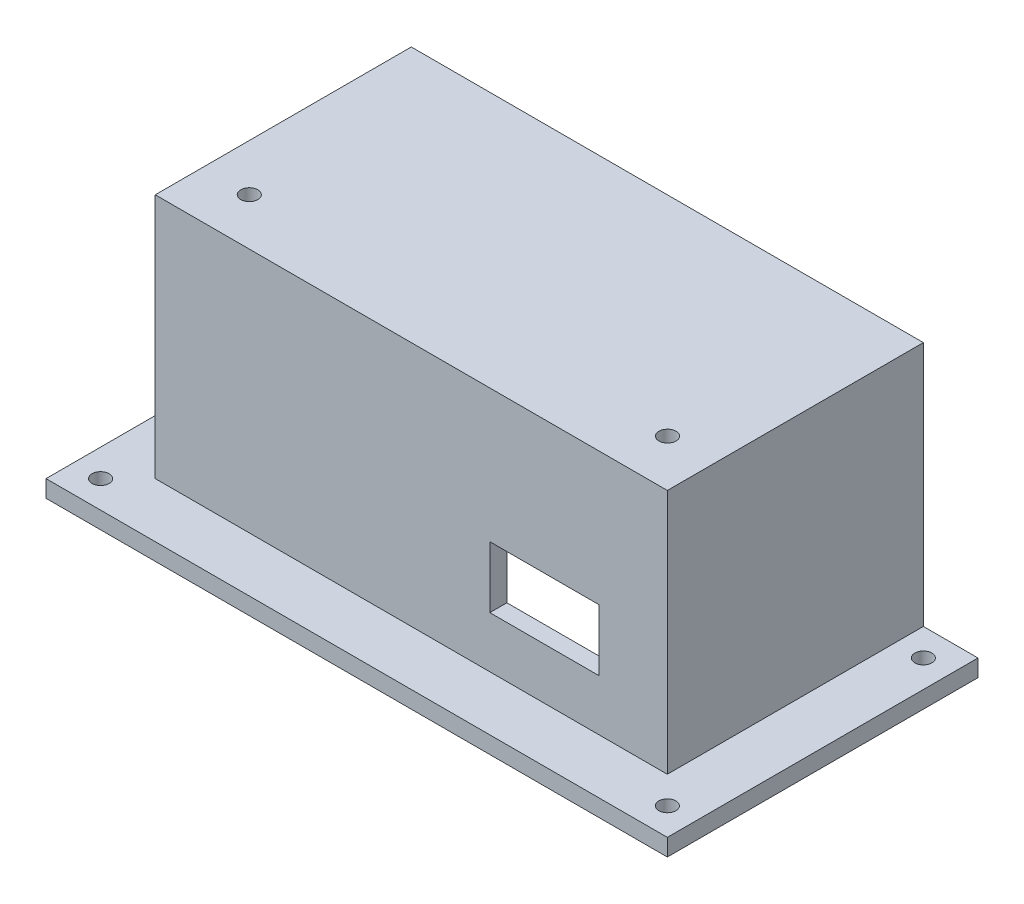
ISO-10303-21;
HEADER;
FILE_DESCRIPTION(('STEP AP214'),'2;1');
FILE_NAME('part.step','',(''),(''),'','','');
FILE_SCHEMA(('AUTOMOTIVE_DESIGN { 1 0 10303 214 1 1 1 1 }'));
ENDSEC;
DATA;
#1=APPLICATION_CONTEXT('core data for automotive mechanical design processes');
#2=APPLICATION_PROTOCOL_DEFINITION('international standard','automotive_design',2000,#1);
#3=PRODUCT_CONTEXT('',#1,'mechanical');
#4=PRODUCT('Part','Part','',(#3));
#5=PRODUCT_RELATED_PRODUCT_CATEGORY('part','',(#4));
#6=PRODUCT_DEFINITION_FORMATION('','',#4);
#7=PRODUCT_DEFINITION_CONTEXT('part definition',#1,'design');
#8=PRODUCT_DEFINITION('design','',#6,#7);
#9=PRODUCT_DEFINITION_SHAPE('','',#8);
#10=(LENGTH_UNIT() NAMED_UNIT(*) SI_UNIT(.MILLI.,.METRE.));
#11=(NAMED_UNIT(*) PLANE_ANGLE_UNIT() SI_UNIT($,.RADIAN.));
#12=(NAMED_UNIT(*) SI_UNIT($,.STERADIAN.) SOLID_ANGLE_UNIT());
#13=UNCERTAINTY_MEASURE_WITH_UNIT(LENGTH_MEASURE(1.E-05),#10,'distance_accuracy_value','');
#14=(GEOMETRIC_REPRESENTATION_CONTEXT(3) GLOBAL_UNCERTAINTY_ASSIGNED_CONTEXT((#13)) GLOBAL_UNIT_ASSIGNED_CONTEXT((#10,
#11,#12)) REPRESENTATION_CONTEXT('',''));
#15=CARTESIAN_POINT('',(0.,0.,0.));
#16=DIRECTION('',(0.,0.,1.));
#17=DIRECTION('',(1.,0.,0.));
#18=AXIS2_PLACEMENT_3D('',#15,#16,#17);
#19=CARTESIAN_POINT('',(0.,0.,0.));
#20=DIRECTION('',(0.,-1.,0.));
#21=DIRECTION('',(0.,0.,-1.));
#22=AXIS2_PLACEMENT_3D('',#19,#20,#21);
#23=PLANE('',#22);
#24=CARTESIAN_POINT('',(83.34375,0.,-5.58799999999999));
#25=DIRECTION('',(0.,-1.,0.));
#26=DIRECTION('',(0.,0.,-1.));
#27=AXIS2_PLACEMENT_3D('',#24,#25,#26);
#28=CIRCLE('',#27,1.5875);
#29=CARTESIAN_POINT('',(83.34375,0.,-7.17549999999999));
#30=VERTEX_POINT('',#29);
#31=EDGE_CURVE('E240',#30,#30,#28,.T.);
#32=ORIENTED_EDGE('',*,*,#31,.F.);
#33=EDGE_LOOP('',(#32));
#34=FACE_BOUND('',#33,.T.);
#35=CARTESIAN_POINT('',(5.55625,0.,-5.588));
#36=DIRECTION('',(0.,-1.,0.));
#37=DIRECTION('',(0.,0.,-1.));
#38=AXIS2_PLACEMENT_3D('',#35,#36,#37);
#39=CIRCLE('',#38,1.5875);
#40=CARTESIAN_POINT('',(5.55625,0.,-7.1755));
#41=VERTEX_POINT('',#40);
#42=EDGE_CURVE('E241',#41,#41,#39,.T.);
#43=ORIENTED_EDGE('',*,*,#42,.F.);
#44=EDGE_LOOP('',(#43));
#45=FACE_BOUND('',#44,.T.);
#46=DIRECTION('',(0.,0.,1.));
#47=VECTOR('',#46,1.);
#48=CARTESIAN_POINT('',(0.,0.,0.));
#49=LINE('',#48,#47);
#50=CARTESIAN_POINT('',(0.,0.,-41.275));
#51=VERTEX_POINT('',#50);
#52=CARTESIAN_POINT('',(0.,0.,0.));
#53=VERTEX_POINT('',#52);
#54=EDGE_CURVE('E186',#51,#53,#49,.T.);
#55=ORIENTED_EDGE('',*,*,#54,.F.);
#56=DIRECTION('',(-1.,0.,0.));
#57=VECTOR('',#56,1.);
#58=CARTESIAN_POINT('',(0.,0.,-41.275));
#59=LINE('',#58,#57);
#60=CARTESIAN_POINT('',(88.9,0.,-41.275));
#61=VERTEX_POINT('',#60);
#62=EDGE_CURVE('E173',#61,#51,#59,.T.);
#63=ORIENTED_EDGE('',*,*,#62,.F.);
#64=DIRECTION('',(0.,0.,-1.));
#65=VECTOR('',#64,1.);
#66=CARTESIAN_POINT('',(88.9,0.,0.));
#67=LINE('',#66,#65);
#68=CARTESIAN_POINT('',(88.9,0.,0.));
#69=VERTEX_POINT('',#68);
#70=EDGE_CURVE('E39',#69,#61,#67,.T.);
#71=ORIENTED_EDGE('',*,*,#70,.F.);
#72=DIRECTION('',(1.,0.,0.));
#73=VECTOR('',#72,1.);
#74=CARTESIAN_POINT('',(0.,0.,0.));
#75=LINE('',#74,#73);
#76=EDGE_CURVE('E192',#53,#69,#75,.T.);
#77=ORIENTED_EDGE('',*,*,#76,.F.);
#78=EDGE_LOOP('',(#55,#63,#71,#77));
#79=FACE_BOUND('',#78,.T.);
#80=ADVANCED_FACE('F35',(#34,#45,#79),#23,.T.);
#81=CARTESIAN_POINT('',(0.,3.175,0.));
#82=DIRECTION('',(-1.,0.,0.));
#83=DIRECTION('',(0.,0.,1.));
#84=AXIS2_PLACEMENT_3D('',#81,#82,#83);
#85=PLANE('',#84);
#86=DIRECTION('',(0.,0.,-1.));
#87=VECTOR('',#86,1.);
#88=CARTESIAN_POINT('',(0.,-15.24,-41.275));
#89=LINE('',#88,#87);
#90=CARTESIAN_POINT('',(0.,-15.24,-41.275));
#91=VERTEX_POINT('',#90);
#92=CARTESIAN_POINT('',(0.,-15.24,-44.45));
#93=VERTEX_POINT('',#92);
#94=EDGE_CURVE('E51',#91,#93,#89,.T.);
#95=ORIENTED_EDGE('',*,*,#94,.F.);
#96=DIRECTION('',(0.,-1.,0.));
#97=VECTOR('',#96,1.);
#98=CARTESIAN_POINT('',(0.,0.,-41.275));
#99=LINE('',#98,#97);
#100=EDGE_CURVE('E176',#51,#91,#99,.T.);
#101=ORIENTED_EDGE('',*,*,#100,.F.);
#102=ORIENTED_EDGE('',*,*,#54,.T.);
#103=DIRECTION('',(0.,-1.,0.));
#104=VECTOR('',#103,1.);
#105=CARTESIAN_POINT('',(0.,3.175,0.));
#106=LINE('',#105,#104);
#107=CARTESIAN_POINT('',(0.,-45.72,0.));
#108=VERTEX_POINT('',#107);
#109=EDGE_CURVE('E213',#53,#108,#106,.T.);
#110=ORIENTED_EDGE('',*,*,#109,.T.);
#111=DIRECTION('',(0.,0.,-1.));
#112=VECTOR('',#111,1.);
#113=CARTESIAN_POINT('',(0.,-45.72,0.));
#114=LINE('',#113,#112);
#115=CARTESIAN_POINT('',(0.,-45.72,-44.45));
#116=VERTEX_POINT('',#115);
#117=EDGE_CURVE('E228',#108,#116,#114,.T.);
#118=ORIENTED_EDGE('',*,*,#117,.T.);
#119=DIRECTION('',(0.,-1.,0.));
#120=VECTOR('',#119,1.);
#121=CARTESIAN_POINT('',(0.,3.175,-44.45));
#122=LINE('',#121,#120);
#123=EDGE_CURVE('E211',#93,#116,#122,.T.);
#124=ORIENTED_EDGE('',*,*,#123,.F.);
#125=EDGE_LOOP('',(#95,#101,#102,#110,#118,#124));
#126=FACE_BOUND('',#125,.T.);
#127=ADVANCED_FACE('F185',(#126),#85,.F.);
#128=CARTESIAN_POINT('',(-3.17499999999999,3.175,0.));
#129=DIRECTION('',(1.,0.,0.));
#130=DIRECTION('',(0.,0.,-1.));
#131=AXIS2_PLACEMENT_3D('',#128,#129,#130);
#132=PLANE('',#131);
#133=DIRECTION('',(0.,0.,-1.));
#134=VECTOR('',#133,1.);
#135=CARTESIAN_POINT('',(-3.17499999999999,-42.545,0.));
#136=LINE('',#135,#134);
#137=CARTESIAN_POINT('',(-3.17499999999999,-42.545,3.175));
#138=VERTEX_POINT('',#137);
#139=CARTESIAN_POINT('',(-3.17499999999999,-42.545,-44.45));
#140=VERTEX_POINT('',#139);
#141=EDGE_CURVE('E260',#138,#140,#136,.T.);
#142=ORIENTED_EDGE('',*,*,#141,.F.);
#143=DIRECTION('',(0.,-1.,0.));
#144=VECTOR('',#143,1.);
#145=CARTESIAN_POINT('',(-3.17499999999999,3.175,3.175));
#146=LINE('',#145,#144);
#147=CARTESIAN_POINT('',(-3.17499999999999,3.175,3.175));
#148=VERTEX_POINT('',#147);
#149=EDGE_CURVE('E206',#148,#138,#146,.T.);
#150=ORIENTED_EDGE('',*,*,#149,.F.);
#151=DIRECTION('',(0.,0.,1.));
#152=VECTOR('',#151,1.);
#153=CARTESIAN_POINT('',(-3.17499999999999,3.175,0.));
#154=LINE('',#153,#152);
#155=CARTESIAN_POINT('',(-3.17499999999999,3.175,-44.45));
#156=VERTEX_POINT('',#155);
#157=EDGE_CURVE('E203',#156,#148,#154,.T.);
#158=ORIENTED_EDGE('',*,*,#157,.F.);
#159=DIRECTION('',(0.,-1.,0.));
#160=VECTOR('',#159,1.);
#161=CARTESIAN_POINT('',(-3.17499999999999,3.175,-44.45));
#162=LINE('',#161,#160);
#163=EDGE_CURVE('E209',#156,#140,#162,.T.);
#164=ORIENTED_EDGE('',*,*,#163,.T.);
#165=EDGE_LOOP('',(#142,#150,#158,#164));
#166=FACE_BOUND('',#165,.T.);
#167=ADVANCED_FACE('F396',(#166),#132,.F.);
#168=CARTESIAN_POINT('',(0.,3.175,3.175));
#169=DIRECTION('',(0.,0.,-1.));
#170=DIRECTION('',(-1.,0.,0.));
#171=AXIS2_PLACEMENT_3D('',#168,#169,#170);
#172=PLANE('',#171);
#173=DIRECTION('',(1.,0.,0.));
#174=VECTOR('',#173,1.);
#175=CARTESIAN_POINT('',(59.055,-33.02,3.175));
#176=LINE('',#175,#174);
#177=CARTESIAN_POINT('',(59.055,-33.02,3.175));
#178=VERTEX_POINT('',#177);
#179=CARTESIAN_POINT('',(79.375,-33.02,3.175));
#180=VERTEX_POINT('',#179);
#181=EDGE_CURVE('E326',#178,#180,#176,.T.);
#182=ORIENTED_EDGE('',*,*,#181,.F.);
#183=DIRECTION('',(0.,-1.,0.));
#184=VECTOR('',#183,1.);
#185=CARTESIAN_POINT('',(59.055,-21.59,3.175));
#186=LINE('',#185,#184);
#187=CARTESIAN_POINT('',(59.055,-21.59,3.175));
#188=VERTEX_POINT('',#187);
#189=EDGE_CURVE('E59',#188,#178,#186,.T.);
#190=ORIENTED_EDGE('',*,*,#189,.F.);
#191=DIRECTION('',(-1.,0.,0.));
#192=VECTOR('',#191,1.);
#193=CARTESIAN_POINT('',(59.055,-21.59,3.175));
#194=LINE('',#193,#192);
#195=CARTESIAN_POINT('',(79.375,-21.59,3.175));
#196=VERTEX_POINT('',#195);
#197=EDGE_CURVE('E319',#196,#188,#194,.T.);
#198=ORIENTED_EDGE('',*,*,#197,.F.);
#199=DIRECTION('',(0.,1.,0.));
#200=VECTOR('',#199,1.);
#201=CARTESIAN_POINT('',(79.375,-21.59,3.175));
#202=LINE('',#201,#200);
#203=EDGE_CURVE('E323',#180,#196,#202,.T.);
#204=ORIENTED_EDGE('',*,*,#203,.F.);
#205=EDGE_LOOP('',(#182,#190,#198,#204));
#206=FACE_BOUND('',#205,.T.);
#207=DIRECTION('',(-1.,0.,0.));
#208=VECTOR('',#207,1.);
#209=CARTESIAN_POINT('',(0.,-42.545,3.175));
#210=LINE('',#209,#208);
#211=CARTESIAN_POINT('',(92.075,-42.545,3.175));
#212=VERTEX_POINT('',#211);
#213=EDGE_CURVE('E282',#212,#138,#210,.T.);
#214=ORIENTED_EDGE('',*,*,#213,.F.);
#215=DIRECTION('',(0.,-1.,0.));
#216=VECTOR('',#215,1.);
#217=CARTESIAN_POINT('',(92.075,3.175,3.175));
#218=LINE('',#217,#216);
#219=CARTESIAN_POINT('',(92.075,3.175,3.175));
#220=VERTEX_POINT('',#219);
#221=EDGE_CURVE('E202',#220,#212,#218,.T.);
#222=ORIENTED_EDGE('',*,*,#221,.F.);
#223=DIRECTION('',(1.,0.,0.));
#224=VECTOR('',#223,1.);
#225=CARTESIAN_POINT('',(0.,3.175,3.175));
#226=LINE('',#225,#224);
#227=EDGE_CURVE('E217',#148,#220,#226,.T.);
#228=ORIENTED_EDGE('',*,*,#227,.F.);
#229=ORIENTED_EDGE('',*,*,#149,.T.);
#230=EDGE_LOOP('',(#214,#222,#228,#229));
#231=FACE_BOUND('',#230,.T.);
#232=ADVANCED_FACE('F436',(#206,#231),#172,.F.);
#233=CARTESIAN_POINT('',(92.075,3.175,0.));
#234=DIRECTION('',(1.,0.,0.));
#235=DIRECTION('',(0.,0.,-1.));
#236=AXIS2_PLACEMENT_3D('',#233,#234,#235);
#237=PLANE('',#236);
#238=ORIENTED_EDGE('',*,*,#221,.T.);
#239=DIRECTION('',(0.,0.,-1.));
#240=VECTOR('',#239,1.);
#241=CARTESIAN_POINT('',(92.075,-42.545,0.));
#242=LINE('',#241,#240);
#243=CARTESIAN_POINT('',(92.075,-42.545,-44.45));
#244=VERTEX_POINT('',#243);
#245=EDGE_CURVE('E280',#212,#244,#242,.T.);
#246=ORIENTED_EDGE('',*,*,#245,.T.);
#247=DIRECTION('',(0.,-1.,0.));
#248=VECTOR('',#247,1.);
#249=CARTESIAN_POINT('',(92.075,3.175,-44.45));
#250=LINE('',#249,#248);
#251=CARTESIAN_POINT('',(92.075,3.175,-44.45));
#252=VERTEX_POINT('',#251);
#253=EDGE_CURVE('E199',#252,#244,#250,.T.);
#254=ORIENTED_EDGE('',*,*,#253,.F.);
#255=DIRECTION('',(0.,0.,1.));
#256=VECTOR('',#255,1.);
#257=CARTESIAN_POINT('',(92.075,3.175,0.));
#258=LINE('',#257,#256);
#259=EDGE_CURVE('E219',#252,#220,#258,.T.);
#260=ORIENTED_EDGE('',*,*,#259,.T.);
#261=EDGE_LOOP('',(#238,#246,#254,#260));
#262=FACE_BOUND('',#261,.T.);
#263=ADVANCED_FACE('F403',(#262),#237,.T.);
#264=CARTESIAN_POINT('',(0.,3.175,-44.45));
#265=DIRECTION('',(0.,0.,1.));
#266=DIRECTION('',(1.,0.,0.));
#267=AXIS2_PLACEMENT_3D('',#264,#265,#266);
#268=PLANE('',#267);
#269=DIRECTION('',(0.,-1.,0.));
#270=VECTOR('',#269,1.);
#271=CARTESIAN_POINT('',(88.9,3.175,-44.45));
#272=LINE('',#271,#270);
#273=CARTESIAN_POINT('',(88.9,-2.54,-44.45));
#274=VERTEX_POINT('',#273);
#275=CARTESIAN_POINT('',(88.9,-45.72,-44.45));
#276=VERTEX_POINT('',#275);
#277=EDGE_CURVE('E194',#274,#276,#272,.T.);
#278=ORIENTED_EDGE('',*,*,#277,.F.);
#279=DIRECTION('',(-1.,0.,0.));
#280=VECTOR('',#279,1.);
#281=CARTESIAN_POINT('',(0.,-2.54,-44.45));
#282=LINE('',#281,#280);
#283=CARTESIAN_POINT('',(44.45,-2.54,-44.45));
#284=VERTEX_POINT('',#283);
#285=EDGE_CURVE('E353',#274,#284,#282,.T.);
#286=ORIENTED_EDGE('',*,*,#285,.T.);
#287=DIRECTION('',(0.,-1.,0.));
#288=VECTOR('',#287,1.);
#289=CARTESIAN_POINT('',(44.45,0.,-44.45));
#290=LINE('',#289,#288);
#291=CARTESIAN_POINT('',(44.45,-15.24,-44.45));
#292=VERTEX_POINT('',#291);
#293=EDGE_CURVE('E350',#284,#292,#290,.T.);
#294=ORIENTED_EDGE('',*,*,#293,.T.);
#295=DIRECTION('',(1.,0.,0.));
#296=VECTOR('',#295,1.);
#297=CARTESIAN_POINT('',(0.,-15.24,-44.45));
#298=LINE('',#297,#296);
#299=EDGE_CURVE('E189',#93,#292,#298,.T.);
#300=ORIENTED_EDGE('',*,*,#299,.F.);
#301=ORIENTED_EDGE('',*,*,#123,.T.);
#302=DIRECTION('',(1.,0.,0.));
#303=VECTOR('',#302,1.);
#304=CARTESIAN_POINT('',(0.,-45.72,-44.45));
#305=LINE('',#304,#303);
#306=CARTESIAN_POINT('',(-13.335,-45.72,-44.45));
#307=VERTEX_POINT('',#306);
#308=EDGE_CURVE('E231',#307,#116,#305,.T.);
#309=ORIENTED_EDGE('',*,*,#308,.F.);
#310=DIRECTION('',(0.,-1.,0.));
#311=VECTOR('',#310,1.);
#312=CARTESIAN_POINT('',(-13.335,-42.545,-44.45));
#313=LINE('',#312,#311);
#314=CARTESIAN_POINT('',(-13.335,-42.545,-44.45));
#315=VERTEX_POINT('',#314);
#316=EDGE_CURVE('E244',#315,#307,#313,.T.);
#317=ORIENTED_EDGE('',*,*,#316,.F.);
#318=DIRECTION('',(-1.,0.,0.));
#319=VECTOR('',#318,1.);
#320=CARTESIAN_POINT('',(0.,-42.545,-44.45));
#321=LINE('',#320,#319);
#322=EDGE_CURVE('E251',#140,#315,#321,.T.);
#323=ORIENTED_EDGE('',*,*,#322,.F.);
#324=ORIENTED_EDGE('',*,*,#163,.F.);
#325=DIRECTION('',(-1.,0.,0.));
#326=VECTOR('',#325,1.);
#327=CARTESIAN_POINT('',(0.,3.175,-44.45));
#328=LINE('',#327,#326);
#329=EDGE_CURVE('E11',#252,#156,#328,.T.);
#330=ORIENTED_EDGE('',*,*,#329,.F.);
#331=ORIENTED_EDGE('',*,*,#253,.T.);
#332=DIRECTION('',(1.,0.,0.));
#333=VECTOR('',#332,1.);
#334=CARTESIAN_POINT('',(0.,-42.545,-44.4500000000001));
#335=LINE('',#334,#333);
#336=CARTESIAN_POINT('',(102.235,-42.545,-44.45));
#337=VERTEX_POINT('',#336);
#338=EDGE_CURVE('E277',#244,#337,#335,.T.);
#339=ORIENTED_EDGE('',*,*,#338,.T.);
#340=DIRECTION('',(0.,-1.,0.));
#341=VECTOR('',#340,1.);
#342=CARTESIAN_POINT('',(102.235,-42.545,-44.45));
#343=LINE('',#342,#341);
#344=CARTESIAN_POINT('',(102.235,-45.72,-44.45));
#345=VERTEX_POINT('',#344);
#346=EDGE_CURVE('E247',#337,#345,#343,.T.);
#347=ORIENTED_EDGE('',*,*,#346,.T.);
#348=EDGE_CURVE('E232',#276,#345,#305,.T.);
#349=ORIENTED_EDGE('',*,*,#348,.F.);
#350=EDGE_LOOP('',(#278,#286,#294,#300,#301,#309,#317,#323,#324,#330,#331,#339,#347,#349));
#351=FACE_BOUND('',#350,.T.);
#352=ADVANCED_FACE('F37',(#351),#268,.F.);
#353=CARTESIAN_POINT('',(0.,3.175,0.));
#354=DIRECTION('',(0.,-1.,0.));
#355=DIRECTION('',(0.,0.,-1.));
#356=AXIS2_PLACEMENT_3D('',#353,#354,#355);
#357=PLANE('',#356);
#358=CARTESIAN_POINT('',(83.34375,3.175,-5.58799999999999));
#359=DIRECTION('',(0.,-1.,0.));
#360=DIRECTION('',(0.,0.,-1.));
#361=AXIS2_PLACEMENT_3D('',#358,#359,#360);
#362=CIRCLE('',#361,1.5875);
#363=CARTESIAN_POINT('',(83.34375,3.175,-7.17549999999999));
#364=VERTEX_POINT('',#363);
#365=EDGE_CURVE('E234',#364,#364,#362,.T.);
#366=ORIENTED_EDGE('',*,*,#365,.T.);
#367=EDGE_LOOP('',(#366));
#368=FACE_BOUND('',#367,.T.);
#369=CARTESIAN_POINT('',(5.55625,3.175,-5.588));
#370=DIRECTION('',(0.,-1.,0.));
#371=DIRECTION('',(0.,0.,-1.));
#372=AXIS2_PLACEMENT_3D('',#369,#370,#371);
#373=CIRCLE('',#372,1.5875);
#374=CARTESIAN_POINT('',(5.55625,3.175,-7.1755));
#375=VERTEX_POINT('',#374);
#376=EDGE_CURVE('E237',#375,#375,#373,.T.);
#377=ORIENTED_EDGE('',*,*,#376,.T.);
#378=EDGE_LOOP('',(#377));
#379=FACE_BOUND('',#378,.T.);
#380=ORIENTED_EDGE('',*,*,#259,.F.);
#381=ORIENTED_EDGE('',*,*,#329,.T.);
#382=ORIENTED_EDGE('',*,*,#157,.T.);
#383=ORIENTED_EDGE('',*,*,#227,.T.);
#384=EDGE_LOOP('',(#380,#381,#382,#383));
#385=FACE_BOUND('',#384,.T.);
#386=ADVANCED_FACE('F400',(#368,#379,#385),#357,.F.);
#387=CARTESIAN_POINT('',(88.9,3.175,0.));
#388=DIRECTION('',(1.,0.,0.));
#389=DIRECTION('',(0.,0.,-1.));
#390=AXIS2_PLACEMENT_3D('',#387,#388,#389);
#391=PLANE('',#390);
#392=DIRECTION('',(0.,1.,0.));
#393=VECTOR('',#392,1.);
#394=CARTESIAN_POINT('',(88.9,0.,-41.275));
#395=LINE('',#394,#393);
#396=CARTESIAN_POINT('',(88.9,-2.54,-41.275));
#397=VERTEX_POINT('',#396);
#398=EDGE_CURVE('E179',#397,#61,#395,.T.);
#399=ORIENTED_EDGE('',*,*,#398,.F.);
#400=DIRECTION('',(0.,0.,-1.));
#401=VECTOR('',#400,1.);
#402=CARTESIAN_POINT('',(88.9,-2.54,-41.275));
#403=LINE('',#402,#401);
#404=EDGE_CURVE('E340',#397,#274,#403,.T.);
#405=ORIENTED_EDGE('',*,*,#404,.T.);
#406=ORIENTED_EDGE('',*,*,#277,.T.);
#407=DIRECTION('',(0.,0.,1.));
#408=VECTOR('',#407,1.);
#409=CARTESIAN_POINT('',(88.9,-45.72,0.));
#410=LINE('',#409,#408);
#411=CARTESIAN_POINT('',(88.9,-45.72,0.));
#412=VERTEX_POINT('',#411);
#413=EDGE_CURVE('E222',#276,#412,#410,.T.);
#414=ORIENTED_EDGE('',*,*,#413,.T.);
#415=DIRECTION('',(0.,-1.,0.));
#416=VECTOR('',#415,1.);
#417=CARTESIAN_POINT('',(88.9,3.175,0.));
#418=LINE('',#417,#416);
#419=EDGE_CURVE('E196',#69,#412,#418,.T.);
#420=ORIENTED_EDGE('',*,*,#419,.F.);
#421=ORIENTED_EDGE('',*,*,#70,.T.);
#422=EDGE_LOOP('',(#399,#405,#406,#414,#420,#421));
#423=FACE_BOUND('',#422,.T.);
#424=ADVANCED_FACE('F368',(#423),#391,.F.);
#425=CARTESIAN_POINT('',(0.,3.175,0.));
#426=DIRECTION('',(0.,0.,1.));
#427=DIRECTION('',(1.,0.,0.));
#428=AXIS2_PLACEMENT_3D('',#425,#426,#427);
#429=PLANE('',#428);
#430=DIRECTION('',(-1.,0.,0.));
#431=VECTOR('',#430,1.);
#432=CARTESIAN_POINT('',(59.055,-21.59,0.));
#433=LINE('',#432,#431);
#434=CARTESIAN_POINT('',(79.375,-21.59,0.));
#435=VERTEX_POINT('',#434);
#436=CARTESIAN_POINT('',(59.055,-21.59,0.));
#437=VERTEX_POINT('',#436);
#438=EDGE_CURVE('E314',#435,#437,#433,.T.);
#439=ORIENTED_EDGE('',*,*,#438,.T.);
#440=DIRECTION('',(0.,-1.,0.));
#441=VECTOR('',#440,1.);
#442=CARTESIAN_POINT('',(59.055,-21.59,0.));
#443=LINE('',#442,#441);
#444=CARTESIAN_POINT('',(59.055,-33.02,0.));
#445=VERTEX_POINT('',#444);
#446=EDGE_CURVE('E322',#437,#445,#443,.T.);
#447=ORIENTED_EDGE('',*,*,#446,.T.);
#448=DIRECTION('',(1.,0.,0.));
#449=VECTOR('',#448,1.);
#450=CARTESIAN_POINT('',(59.055,-33.02,0.));
#451=LINE('',#450,#449);
#452=CARTESIAN_POINT('',(79.375,-33.02,0.));
#453=VERTEX_POINT('',#452);
#454=EDGE_CURVE('E335',#445,#453,#451,.T.);
#455=ORIENTED_EDGE('',*,*,#454,.T.);
#456=DIRECTION('',(0.,1.,0.));
#457=VECTOR('',#456,1.);
#458=CARTESIAN_POINT('',(79.375,-21.59,0.));
#459=LINE('',#458,#457);
#460=EDGE_CURVE('E332',#453,#435,#459,.T.);
#461=ORIENTED_EDGE('',*,*,#460,.T.);
#462=EDGE_LOOP('',(#439,#447,#455,#461));
#463=FACE_BOUND('',#462,.T.);
#464=ORIENTED_EDGE('',*,*,#76,.T.);
#465=ORIENTED_EDGE('',*,*,#419,.T.);
#466=DIRECTION('',(-1.,0.,0.));
#467=VECTOR('',#466,1.);
#468=CARTESIAN_POINT('',(0.,-45.72,0.));
#469=LINE('',#468,#467);
#470=EDGE_CURVE('E225',#412,#108,#469,.T.);
#471=ORIENTED_EDGE('',*,*,#470,.T.);
#472=ORIENTED_EDGE('',*,*,#109,.F.);
#473=EDGE_LOOP('',(#464,#465,#471,#472));
#474=FACE_BOUND('',#473,.T.);
#475=ADVANCED_FACE('F372',(#463,#474),#429,.F.);
#476=CARTESIAN_POINT('',(0.,-45.72,0.));
#477=DIRECTION('',(0.,-1.,0.));
#478=DIRECTION('',(0.,0.,-1.));
#479=AXIS2_PLACEMENT_3D('',#476,#477,#478);
#480=PLANE('',#479);
#481=CARTESIAN_POINT('',(97.155,-45.72,-39.37));
#482=DIRECTION('',(0.,1.,0.));
#483=DIRECTION('',(0.,0.,1.));
#484=AXIS2_PLACEMENT_3D('',#481,#482,#483);
#485=CIRCLE('',#484,1.5875);
#486=CARTESIAN_POINT('',(97.155,-45.72,-37.7825));
#487=VERTEX_POINT('',#486);
#488=EDGE_CURVE('E296',#487,#487,#485,.T.);
#489=ORIENTED_EDGE('',*,*,#488,.T.);
#490=EDGE_LOOP('',(#489));
#491=FACE_BOUND('',#490,.T.);
#492=CARTESIAN_POINT('',(97.155,-45.72,8.25500000000001));
#493=DIRECTION('',(0.,1.,0.));
#494=DIRECTION('',(0.,0.,1.));
#495=AXIS2_PLACEMENT_3D('',#492,#493,#494);
#496=CIRCLE('',#495,1.5875);
#497=CARTESIAN_POINT('',(97.155,-45.72,9.8425));
#498=VERTEX_POINT('',#497);
#499=EDGE_CURVE('E303',#498,#498,#496,.T.);
#500=ORIENTED_EDGE('',*,*,#499,.T.);
#501=EDGE_LOOP('',(#500));
#502=FACE_BOUND('',#501,.T.);
#503=CARTESIAN_POINT('',(-8.255,-45.72,8.255));
#504=DIRECTION('',(0.,1.,0.));
#505=DIRECTION('',(0.,0.,1.));
#506=AXIS2_PLACEMENT_3D('',#503,#504,#505);
#507=CIRCLE('',#506,1.5875);
#508=CARTESIAN_POINT('',(-8.255,-45.72,9.8425));
#509=VERTEX_POINT('',#508);
#510=EDGE_CURVE('E290',#509,#509,#507,.T.);
#511=ORIENTED_EDGE('',*,*,#510,.T.);
#512=EDGE_LOOP('',(#511));
#513=FACE_BOUND('',#512,.T.);
#514=CARTESIAN_POINT('',(-8.255,-45.72,-39.37));
#515=DIRECTION('',(0.,1.,0.));
#516=DIRECTION('',(0.,0.,1.));
#517=AXIS2_PLACEMENT_3D('',#514,#515,#516);
#518=CIRCLE('',#517,1.5875);
#519=CARTESIAN_POINT('',(-8.255,-45.72,-37.7825));
#520=VERTEX_POINT('',#519);
#521=EDGE_CURVE('E267',#520,#520,#518,.T.);
#522=ORIENTED_EDGE('',*,*,#521,.T.);
#523=EDGE_LOOP('',(#522));
#524=FACE_BOUND('',#523,.T.);
#525=ORIENTED_EDGE('',*,*,#348,.T.);
#526=DIRECTION('',(0.,0.,1.));
#527=VECTOR('',#526,1.);
#528=CARTESIAN_POINT('',(102.235,-45.72,0.));
#529=LINE('',#528,#527);
#530=CARTESIAN_POINT('',(102.235,-45.72,13.335));
#531=VERTEX_POINT('',#530);
#532=EDGE_CURVE('E264',#345,#531,#529,.T.);
#533=ORIENTED_EDGE('',*,*,#532,.T.);
#534=DIRECTION('',(-1.,0.,0.));
#535=VECTOR('',#534,1.);
#536=CARTESIAN_POINT('',(0.,-45.72,13.335));
#537=LINE('',#536,#535);
#538=CARTESIAN_POINT('',(-13.335,-45.72,13.335));
#539=VERTEX_POINT('',#538);
#540=EDGE_CURVE('E261',#531,#539,#537,.T.);
#541=ORIENTED_EDGE('',*,*,#540,.T.);
#542=DIRECTION('',(0.,0.,1.));
#543=VECTOR('',#542,1.);
#544=CARTESIAN_POINT('',(-13.335,-45.72,0.));
#545=LINE('',#544,#543);
#546=EDGE_CURVE('E257',#307,#539,#545,.T.);
#547=ORIENTED_EDGE('',*,*,#546,.F.);
#548=ORIENTED_EDGE('',*,*,#308,.T.);
#549=ORIENTED_EDGE('',*,*,#117,.F.);
#550=ORIENTED_EDGE('',*,*,#470,.F.);
#551=ORIENTED_EDGE('',*,*,#413,.F.);
#552=EDGE_LOOP('',(#525,#533,#541,#547,#548,#549,#550,#551));
#553=FACE_BOUND('',#552,.T.);
#554=ADVANCED_FACE('F377',(#491,#502,#513,#524,#553),#480,.T.);
#555=CARTESIAN_POINT('',(5.55625,45.72,-5.588));
#556=DIRECTION('',(0.,-1.,0.));
#557=DIRECTION('',(0.,0.,-1.));
#558=AXIS2_PLACEMENT_3D('',#555,#556,#557);
#559=CYLINDRICAL_SURFACE('',#558,1.5875);
#560=ORIENTED_EDGE('',*,*,#42,.T.);
#561=EDGE_LOOP('',(#560));
#562=FACE_BOUND('',#561,.T.);
#563=ORIENTED_EDGE('',*,*,#376,.F.);
#564=EDGE_LOOP('',(#563));
#565=FACE_BOUND('',#564,.T.);
#566=ADVANCED_FACE('F449',(#562,#565),#559,.F.);
#567=CARTESIAN_POINT('',(83.34375,45.72,-5.58799999999999));
#568=DIRECTION('',(0.,-1.,0.));
#569=DIRECTION('',(0.,0.,-1.));
#570=AXIS2_PLACEMENT_3D('',#567,#568,#569);
#571=CYLINDRICAL_SURFACE('',#570,1.5875);
#572=ORIENTED_EDGE('',*,*,#31,.T.);
#573=EDGE_LOOP('',(#572));
#574=FACE_BOUND('',#573,.T.);
#575=ORIENTED_EDGE('',*,*,#365,.F.);
#576=EDGE_LOOP('',(#575));
#577=FACE_BOUND('',#576,.T.);
#578=ADVANCED_FACE('F420',(#574,#577),#571,.F.);
#579=CARTESIAN_POINT('',(-13.335,-42.545,0.));
#580=DIRECTION('',(1.,0.,0.));
#581=DIRECTION('',(0.,0.,-1.));
#582=AXIS2_PLACEMENT_3D('',#579,#580,#581);
#583=PLANE('',#582);
#584=ORIENTED_EDGE('',*,*,#546,.T.);
#585=DIRECTION('',(0.,-1.,0.));
#586=VECTOR('',#585,1.);
#587=CARTESIAN_POINT('',(-13.335,-42.545,13.335));
#588=LINE('',#587,#586);
#589=CARTESIAN_POINT('',(-13.335,-42.545,13.335));
#590=VERTEX_POINT('',#589);
#591=EDGE_CURVE('E253',#590,#539,#588,.T.);
#592=ORIENTED_EDGE('',*,*,#591,.F.);
#593=DIRECTION('',(0.,0.,1.));
#594=VECTOR('',#593,1.);
#595=CARTESIAN_POINT('',(-13.335,-42.545,0.));
#596=LINE('',#595,#594);
#597=EDGE_CURVE('E269',#315,#590,#596,.T.);
#598=ORIENTED_EDGE('',*,*,#597,.F.);
#599=ORIENTED_EDGE('',*,*,#316,.T.);
#600=EDGE_LOOP('',(#584,#592,#598,#599));
#601=FACE_BOUND('',#600,.T.);
#602=ADVANCED_FACE('F385',(#601),#583,.F.);
#603=CARTESIAN_POINT('',(0.,-42.545,13.335));
#604=DIRECTION('',(0.,0.,1.));
#605=DIRECTION('',(1.,0.,0.));
#606=AXIS2_PLACEMENT_3D('',#603,#604,#605);
#607=PLANE('',#606);
#608=ORIENTED_EDGE('',*,*,#540,.F.);
#609=DIRECTION('',(0.,-1.,0.));
#610=VECTOR('',#609,1.);
#611=CARTESIAN_POINT('',(102.235,-42.545,13.335));
#612=LINE('',#611,#610);
#613=CARTESIAN_POINT('',(102.235,-42.545,13.335));
#614=VERTEX_POINT('',#613);
#615=EDGE_CURVE('E250',#614,#531,#612,.T.);
#616=ORIENTED_EDGE('',*,*,#615,.F.);
#617=DIRECTION('',(-1.,0.,0.));
#618=VECTOR('',#617,1.);
#619=CARTESIAN_POINT('',(0.,-42.545,13.335));
#620=LINE('',#619,#618);
#621=EDGE_CURVE('E271',#614,#590,#620,.T.);
#622=ORIENTED_EDGE('',*,*,#621,.T.);
#623=ORIENTED_EDGE('',*,*,#591,.T.);
#624=EDGE_LOOP('',(#608,#616,#622,#623));
#625=FACE_BOUND('',#624,.T.);
#626=ADVANCED_FACE('F412',(#625),#607,.T.);
#627=CARTESIAN_POINT('',(102.235,-42.545,0.));
#628=DIRECTION('',(1.,0.,0.));
#629=DIRECTION('',(0.,0.,-1.));
#630=AXIS2_PLACEMENT_3D('',#627,#628,#629);
#631=PLANE('',#630);
#632=ORIENTED_EDGE('',*,*,#532,.F.);
#633=ORIENTED_EDGE('',*,*,#346,.F.);
#634=DIRECTION('',(0.,0.,1.));
#635=VECTOR('',#634,1.);
#636=CARTESIAN_POINT('',(102.235,-42.545,0.));
#637=LINE('',#636,#635);
#638=EDGE_CURVE('E274',#337,#614,#637,.T.);
#639=ORIENTED_EDGE('',*,*,#638,.T.);
#640=ORIENTED_EDGE('',*,*,#615,.T.);
#641=EDGE_LOOP('',(#632,#633,#639,#640));
#642=FACE_BOUND('',#641,.T.);
#643=ADVANCED_FACE('F408',(#642),#631,.T.);
#644=CARTESIAN_POINT('',(0.,-42.545,0.));
#645=DIRECTION('',(0.,-1.,0.));
#646=DIRECTION('',(0.,0.,-1.));
#647=AXIS2_PLACEMENT_3D('',#644,#645,#646);
#648=PLANE('',#647);
#649=CARTESIAN_POINT('',(97.155,-42.545,-39.37));
#650=DIRECTION('',(0.,1.,0.));
#651=DIRECTION('',(0.,0.,1.));
#652=AXIS2_PLACEMENT_3D('',#649,#650,#651);
#653=CIRCLE('',#652,1.5875);
#654=CARTESIAN_POINT('',(97.155,-42.545,-37.7825));
#655=VERTEX_POINT('',#654);
#656=EDGE_CURVE('E293',#655,#655,#653,.T.);
#657=ORIENTED_EDGE('',*,*,#656,.F.);
#658=EDGE_LOOP('',(#657));
#659=FACE_BOUND('',#658,.T.);
#660=CARTESIAN_POINT('',(97.155,-42.545,8.25500000000001));
#661=DIRECTION('',(0.,1.,0.));
#662=DIRECTION('',(0.,0.,1.));
#663=AXIS2_PLACEMENT_3D('',#660,#661,#662);
#664=CIRCLE('',#663,1.5875);
#665=CARTESIAN_POINT('',(97.155,-42.545,9.8425));
#666=VERTEX_POINT('',#665);
#667=EDGE_CURVE('E300',#666,#666,#664,.T.);
#668=ORIENTED_EDGE('',*,*,#667,.F.);
#669=EDGE_LOOP('',(#668));
#670=FACE_BOUND('',#669,.T.);
#671=CARTESIAN_POINT('',(-8.255,-42.545,8.255));
#672=DIRECTION('',(0.,1.,0.));
#673=DIRECTION('',(0.,0.,1.));
#674=AXIS2_PLACEMENT_3D('',#671,#672,#673);
#675=CIRCLE('',#674,1.5875);
#676=CARTESIAN_POINT('',(-8.255,-42.545,9.8425));
#677=VERTEX_POINT('',#676);
#678=EDGE_CURVE('E306',#677,#677,#675,.T.);
#679=ORIENTED_EDGE('',*,*,#678,.F.);
#680=EDGE_LOOP('',(#679));
#681=FACE_BOUND('',#680,.T.);
#682=CARTESIAN_POINT('',(-8.255,-42.545,-39.37));
#683=DIRECTION('',(0.,1.,0.));
#684=DIRECTION('',(0.,0.,1.));
#685=AXIS2_PLACEMENT_3D('',#682,#683,#684);
#686=CIRCLE('',#685,1.5875);
#687=CARTESIAN_POINT('',(-8.255,-42.545,-37.7825));
#688=VERTEX_POINT('',#687);
#689=EDGE_CURVE('E287',#688,#688,#686,.T.);
#690=ORIENTED_EDGE('',*,*,#689,.F.);
#691=EDGE_LOOP('',(#690));
#692=FACE_BOUND('',#691,.T.);
#693=ORIENTED_EDGE('',*,*,#141,.T.);
#694=ORIENTED_EDGE('',*,*,#322,.T.);
#695=ORIENTED_EDGE('',*,*,#597,.T.);
#696=ORIENTED_EDGE('',*,*,#621,.F.);
#697=ORIENTED_EDGE('',*,*,#638,.F.);
#698=ORIENTED_EDGE('',*,*,#338,.F.);
#699=ORIENTED_EDGE('',*,*,#245,.F.);
#700=ORIENTED_EDGE('',*,*,#213,.T.);
#701=EDGE_LOOP('',(#693,#694,#695,#696,#697,#698,#699,#700));
#702=FACE_BOUND('',#701,.T.);
#703=ADVANCED_FACE('F389',(#659,#670,#681,#692,#702),#648,.F.);
#704=CARTESIAN_POINT('',(-8.255,-45.72,-39.37));
#705=DIRECTION('',(0.,1.,0.));
#706=DIRECTION('',(0.,0.,1.));
#707=AXIS2_PLACEMENT_3D('',#704,#705,#706);
#708=CYLINDRICAL_SURFACE('',#707,1.5875);
#709=ORIENTED_EDGE('',*,*,#521,.F.);
#710=EDGE_LOOP('',(#709));
#711=FACE_BOUND('',#710,.T.);
#712=ORIENTED_EDGE('',*,*,#689,.T.);
#713=EDGE_LOOP('',(#712));
#714=FACE_BOUND('',#713,.T.);
#715=ADVANCED_FACE('F503',(#711,#714),#708,.F.);
#716=CARTESIAN_POINT('',(-8.255,-45.72,8.255));
#717=DIRECTION('',(0.,1.,0.));
#718=DIRECTION('',(0.,0.,1.));
#719=AXIS2_PLACEMENT_3D('',#716,#717,#718);
#720=CYLINDRICAL_SURFACE('',#719,1.5875);
#721=ORIENTED_EDGE('',*,*,#510,.F.);
#722=EDGE_LOOP('',(#721));
#723=FACE_BOUND('',#722,.T.);
#724=ORIENTED_EDGE('',*,*,#678,.T.);
#725=EDGE_LOOP('',(#724));
#726=FACE_BOUND('',#725,.T.);
#727=ADVANCED_FACE('F514',(#723,#726),#720,.F.);
#728=CARTESIAN_POINT('',(97.155,-45.72,8.25500000000001));
#729=DIRECTION('',(0.,1.,0.));
#730=DIRECTION('',(0.,0.,1.));
#731=AXIS2_PLACEMENT_3D('',#728,#729,#730);
#732=CYLINDRICAL_SURFACE('',#731,1.5875);
#733=ORIENTED_EDGE('',*,*,#499,.F.);
#734=EDGE_LOOP('',(#733));
#735=FACE_BOUND('',#734,.T.);
#736=ORIENTED_EDGE('',*,*,#667,.T.);
#737=EDGE_LOOP('',(#736));
#738=FACE_BOUND('',#737,.T.);
#739=ADVANCED_FACE('F524',(#735,#738),#732,.F.);
#740=CARTESIAN_POINT('',(97.155,-45.72,-39.37));
#741=DIRECTION('',(0.,1.,0.));
#742=DIRECTION('',(0.,0.,1.));
#743=AXIS2_PLACEMENT_3D('',#740,#741,#742);
#744=CYLINDRICAL_SURFACE('',#743,1.5875);
#745=ORIENTED_EDGE('',*,*,#488,.F.);
#746=EDGE_LOOP('',(#745));
#747=FACE_BOUND('',#746,.T.);
#748=ORIENTED_EDGE('',*,*,#656,.T.);
#749=EDGE_LOOP('',(#748));
#750=FACE_BOUND('',#749,.T.);
#751=ADVANCED_FACE('F534',(#747,#750),#744,.F.);
#752=CARTESIAN_POINT('',(59.055,-21.59,0.));
#753=DIRECTION('',(-1.,0.,0.));
#754=DIRECTION('',(0.,-1.,0.));
#755=AXIS2_PLACEMENT_3D('',#752,#753,#754);
#756=PLANE('',#755);
#757=ORIENTED_EDGE('',*,*,#189,.T.);
#758=DIRECTION('',(0.,0.,1.));
#759=VECTOR('',#758,1.);
#760=CARTESIAN_POINT('',(59.055,-33.02,0.));
#761=LINE('',#760,#759);
#762=EDGE_CURVE('E311',#445,#178,#761,.T.);
#763=ORIENTED_EDGE('',*,*,#762,.F.);
#764=ORIENTED_EDGE('',*,*,#446,.F.);
#765=DIRECTION('',(0.,0.,1.));
#766=VECTOR('',#765,1.);
#767=CARTESIAN_POINT('',(59.055,-21.59,0.));
#768=LINE('',#767,#766);
#769=EDGE_CURVE('E297',#437,#188,#768,.T.);
#770=ORIENTED_EDGE('',*,*,#769,.T.);
#771=EDGE_LOOP('',(#757,#763,#764,#770));
#772=FACE_BOUND('',#771,.T.);
#773=ADVANCED_FACE('F544',(#772),#756,.F.);
#774=CARTESIAN_POINT('',(59.055,-21.59,0.));
#775=DIRECTION('',(0.,1.,0.));
#776=DIRECTION('',(0.,0.,1.));
#777=AXIS2_PLACEMENT_3D('',#774,#775,#776);
#778=PLANE('',#777);
#779=ORIENTED_EDGE('',*,*,#197,.T.);
#780=ORIENTED_EDGE('',*,*,#769,.F.);
#781=ORIENTED_EDGE('',*,*,#438,.F.);
#782=DIRECTION('',(0.,0.,1.));
#783=VECTOR('',#782,1.);
#784=CARTESIAN_POINT('',(79.375,-21.59,0.));
#785=LINE('',#784,#783);
#786=EDGE_CURVE('E316',#435,#196,#785,.T.);
#787=ORIENTED_EDGE('',*,*,#786,.T.);
#788=EDGE_LOOP('',(#779,#780,#781,#787));
#789=FACE_BOUND('',#788,.T.);
#790=ADVANCED_FACE('F569',(#789),#778,.F.);
#791=CARTESIAN_POINT('',(79.375,-21.59,0.));
#792=DIRECTION('',(1.,0.,0.));
#793=DIRECTION('',(0.,0.,-1.));
#794=AXIS2_PLACEMENT_3D('',#791,#792,#793);
#795=PLANE('',#794);
#796=ORIENTED_EDGE('',*,*,#203,.T.);
#797=ORIENTED_EDGE('',*,*,#786,.F.);
#798=ORIENTED_EDGE('',*,*,#460,.F.);
#799=DIRECTION('',(0.,0.,1.));
#800=VECTOR('',#799,1.);
#801=CARTESIAN_POINT('',(79.375,-33.02,0.));
#802=LINE('',#801,#800);
#803=EDGE_CURVE('E313',#453,#180,#802,.T.);
#804=ORIENTED_EDGE('',*,*,#803,.T.);
#805=EDGE_LOOP('',(#796,#797,#798,#804));
#806=FACE_BOUND('',#805,.T.);
#807=ADVANCED_FACE('F578',(#806),#795,.F.);
#808=CARTESIAN_POINT('',(59.055,-33.02,0.));
#809=DIRECTION('',(0.,-1.,0.));
#810=DIRECTION('',(0.,0.,-1.));
#811=AXIS2_PLACEMENT_3D('',#808,#809,#810);
#812=PLANE('',#811);
#813=ORIENTED_EDGE('',*,*,#181,.T.);
#814=ORIENTED_EDGE('',*,*,#803,.F.);
#815=ORIENTED_EDGE('',*,*,#454,.F.);
#816=ORIENTED_EDGE('',*,*,#762,.T.);
#817=EDGE_LOOP('',(#813,#814,#815,#816));
#818=FACE_BOUND('',#817,.T.);
#819=ADVANCED_FACE('F588',(#818),#812,.F.);
#820=CARTESIAN_POINT('',(0.,-15.24,-41.275));
#821=DIRECTION('',(0.,1.,0.));
#822=DIRECTION('',(-1.,0.,0.));
#823=AXIS2_PLACEMENT_3D('',#820,#821,#822);
#824=PLANE('',#823);
#825=ORIENTED_EDGE('',*,*,#299,.T.);
#826=DIRECTION('',(0.,0.,-1.));
#827=VECTOR('',#826,1.);
#828=CARTESIAN_POINT('',(44.45,-15.24,-41.275));
#829=LINE('',#828,#827);
#830=CARTESIAN_POINT('',(44.45,-15.24,-41.275));
#831=VERTEX_POINT('',#830);
#832=EDGE_CURVE('E346',#831,#292,#829,.T.);
#833=ORIENTED_EDGE('',*,*,#832,.F.);
#834=DIRECTION('',(1.,0.,0.));
#835=VECTOR('',#834,1.);
#836=CARTESIAN_POINT('',(0.,-15.24,-41.275));
#837=LINE('',#836,#835);
#838=EDGE_CURVE('E344',#91,#831,#837,.T.);
#839=ORIENTED_EDGE('',*,*,#838,.F.);
#840=ORIENTED_EDGE('',*,*,#94,.T.);
#841=EDGE_LOOP('',(#825,#833,#839,#840));
#842=FACE_BOUND('',#841,.T.);
#843=ADVANCED_FACE('F597',(#842),#824,.F.);
#844=CARTESIAN_POINT('',(44.45,0.,-41.275));
#845=DIRECTION('',(1.,0.,0.));
#846=DIRECTION('',(0.,0.,-1.));
#847=AXIS2_PLACEMENT_3D('',#844,#845,#846);
#848=PLANE('',#847);
#849=ORIENTED_EDGE('',*,*,#293,.F.);
#850=DIRECTION('',(0.,0.,-1.));
#851=VECTOR('',#850,1.);
#852=CARTESIAN_POINT('',(44.45,-2.54,-41.275));
#853=LINE('',#852,#851);
#854=CARTESIAN_POINT('',(44.45,-2.54,-41.275));
#855=VERTEX_POINT('',#854);
#856=EDGE_CURVE('E343',#855,#284,#853,.T.);
#857=ORIENTED_EDGE('',*,*,#856,.F.);
#858=DIRECTION('',(0.,-1.,0.));
#859=VECTOR('',#858,1.);
#860=CARTESIAN_POINT('',(44.45,0.,-41.275));
#861=LINE('',#860,#859);
#862=EDGE_CURVE('E357',#855,#831,#861,.T.);
#863=ORIENTED_EDGE('',*,*,#862,.T.);
#864=ORIENTED_EDGE('',*,*,#832,.T.);
#865=EDGE_LOOP('',(#849,#857,#863,#864));
#866=FACE_BOUND('',#865,.T.);
#867=ADVANCED_FACE('F634',(#866),#848,.T.);
#868=CARTESIAN_POINT('',(0.,-2.54,-41.275));
#869=DIRECTION('',(0.,-1.,0.));
#870=DIRECTION('',(0.,0.,-1.));
#871=AXIS2_PLACEMENT_3D('',#868,#869,#870);
#872=PLANE('',#871);
#873=ORIENTED_EDGE('',*,*,#285,.F.);
#874=ORIENTED_EDGE('',*,*,#404,.F.);
#875=DIRECTION('',(-1.,0.,0.));
#876=VECTOR('',#875,1.);
#877=CARTESIAN_POINT('',(0.,-2.54,-41.275));
#878=LINE('',#877,#876);
#879=EDGE_CURVE('E360',#397,#855,#878,.T.);
#880=ORIENTED_EDGE('',*,*,#879,.T.);
#881=ORIENTED_EDGE('',*,*,#856,.T.);
#882=EDGE_LOOP('',(#873,#874,#880,#881));
#883=FACE_BOUND('',#882,.T.);
#884=ADVANCED_FACE('F364',(#883),#872,.T.);
#885=CARTESIAN_POINT('',(0.,0.,-41.275));
#886=DIRECTION('',(0.,0.,-1.));
#887=DIRECTION('',(-1.,0.,0.));
#888=AXIS2_PLACEMENT_3D('',#885,#886,#887);
#889=PLANE('',#888);
#890=ORIENTED_EDGE('',*,*,#100,.T.);
#891=ORIENTED_EDGE('',*,*,#838,.T.);
#892=ORIENTED_EDGE('',*,*,#862,.F.);
#893=ORIENTED_EDGE('',*,*,#879,.F.);
#894=ORIENTED_EDGE('',*,*,#398,.T.);
#895=ORIENTED_EDGE('',*,*,#62,.T.);
#896=EDGE_LOOP('',(#890,#891,#892,#893,#894,#895));
#897=FACE_BOUND('',#896,.T.);
#898=ADVANCED_FACE('F175',(#897),#889,.F.);
#899=CLOSED_SHELL('',(#80,#127,#167,#232,#263,#352,#386,#424,#475,#554,#566,#578,#602,#626,#643,
#703,#715,#727,#739,#751,#773,#790,#807,#819,#843,#867,#884,#898));
#900=MANIFOLD_SOLID_BREP('B2',#899);
#901=ADVANCED_BREP_SHAPE_REPRESENTATION('',(#18,#900),#14);
#902=SHAPE_DEFINITION_REPRESENTATION(#9,#901);
ENDSEC;
END-ISO-10303-21;
